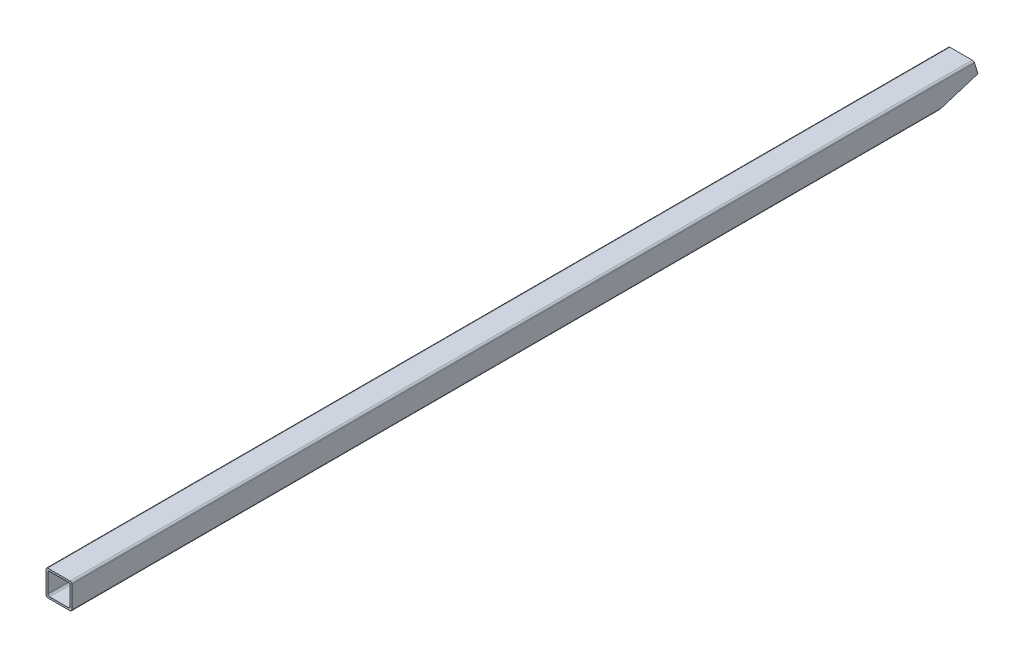
ISO-10303-21;
HEADER;
FILE_DESCRIPTION(('STEP AP214'),'2;1');
FILE_NAME('part.step','',(''),(''),'','','');
FILE_SCHEMA(('AUTOMOTIVE_DESIGN { 1 0 10303 214 1 1 1 1 }'));
ENDSEC;
DATA;
#1=APPLICATION_CONTEXT('core data for automotive mechanical design processes');
#2=APPLICATION_PROTOCOL_DEFINITION('international standard','automotive_design',2000,#1);
#3=PRODUCT_CONTEXT('',#1,'mechanical');
#4=PRODUCT('Part','Part','',(#3));
#5=PRODUCT_RELATED_PRODUCT_CATEGORY('part','',(#4));
#6=PRODUCT_DEFINITION_FORMATION('','',#4);
#7=PRODUCT_DEFINITION_CONTEXT('part definition',#1,'design');
#8=PRODUCT_DEFINITION('design','',#6,#7);
#9=PRODUCT_DEFINITION_SHAPE('','',#8);
#10=(LENGTH_UNIT() NAMED_UNIT(*) SI_UNIT(.MILLI.,.METRE.));
#11=(NAMED_UNIT(*) PLANE_ANGLE_UNIT() SI_UNIT($,.RADIAN.));
#12=(NAMED_UNIT(*) SI_UNIT($,.STERADIAN.) SOLID_ANGLE_UNIT());
#13=UNCERTAINTY_MEASURE_WITH_UNIT(LENGTH_MEASURE(1.E-05),#10,'distance_accuracy_value','');
#14=(GEOMETRIC_REPRESENTATION_CONTEXT(3) GLOBAL_UNCERTAINTY_ASSIGNED_CONTEXT((#13)) GLOBAL_UNIT_ASSIGNED_CONTEXT((#10,
#11,#12)) REPRESENTATION_CONTEXT('',''));
#15=CARTESIAN_POINT('',(0.,0.,0.));
#16=DIRECTION('',(0.,0.,1.));
#17=DIRECTION('',(1.,0.,0.));
#18=AXIS2_PLACEMENT_3D('',#15,#16,#17);
#19=CARTESIAN_POINT('',(2.54,-35.56,1340.));
#20=DIRECTION('',(0.,0.,-1.));
#21=DIRECTION('',(-1.,0.,0.));
#22=AXIS2_PLACEMENT_3D('',#19,#20,#21);
#23=CYLINDRICAL_SURFACE('',#22,2.54);
#24=CARTESIAN_POINT('',(2.54,-35.56,52.8450381213679));
#25=DIRECTION('',(0.,-0.954500927456525,-0.298207946716101));
#26=DIRECTION('',(0.,0.298207946716101,-0.954500927456525));
#27=AXIS2_PLACEMENT_3D('',#24,#25,#26);
#28=ELLIPSE('',#27,8.51754632286215,2.54);
#29=CARTESIAN_POINT('',(2.54000000000002,-38.1,60.9750439861938));
#30=VERTEX_POINT('',#29);
#31=CARTESIAN_POINT('',(0.,-35.56,52.8450381213679));
#32=VERTEX_POINT('',#31);
#33=EDGE_CURVE('E182',#30,#32,#28,.T.);
#34=ORIENTED_EDGE('',*,*,#33,.F.);
#35=DIRECTION('',(0.,0.,-1.));
#36=VECTOR('',#35,1.);
#37=CARTESIAN_POINT('',(2.54000000000002,-38.1,1340.));
#38=LINE('',#37,#36);
#39=CARTESIAN_POINT('',(2.54000000000002,-38.1,1340.));
#40=VERTEX_POINT('',#39);
#41=EDGE_CURVE('E60',#40,#30,#38,.T.);
#42=ORIENTED_EDGE('',*,*,#41,.F.);
#43=CARTESIAN_POINT('',(2.54,-35.56,1340.));
#44=DIRECTION('',(0.,0.,1.));
#45=DIRECTION('',(1.,0.,0.));
#46=AXIS2_PLACEMENT_3D('',#43,#44,#45);
#47=CIRCLE('',#46,2.54);
#48=CARTESIAN_POINT('',(0.,-35.56,1340.));
#49=VERTEX_POINT('',#48);
#50=EDGE_CURVE('E261',#49,#40,#47,.T.);
#51=ORIENTED_EDGE('',*,*,#50,.F.);
#52=DIRECTION('',(0.,0.,-1.));
#53=VECTOR('',#52,1.);
#54=CARTESIAN_POINT('',(0.,-35.56,1340.));
#55=LINE('',#54,#53);
#56=EDGE_CURVE('E278',#49,#32,#55,.T.);
#57=ORIENTED_EDGE('',*,*,#56,.T.);
#58=EDGE_LOOP('',(#34,#42,#51,#57));
#59=FACE_BOUND('',#58,.T.);
#60=ADVANCED_FACE('F53',(#59),#23,.T.);
#61=CARTESIAN_POINT('',(2.54000000000002,-38.1,1340.));
#62=DIRECTION('',(0.,1.,0.));
#63=DIRECTION('',(0.,0.,1.));
#64=AXIS2_PLACEMENT_3D('',#61,#62,#63);
#65=PLANE('',#64);
#66=DIRECTION('',(-1.,0.,0.));
#67=VECTOR('',#66,1.);
#68=CARTESIAN_POINT('',(38.1,-38.1,60.9750439861938));
#69=LINE('',#68,#67);
#70=CARTESIAN_POINT('',(35.56,-38.1,60.9750439861938));
#71=VERTEX_POINT('',#70);
#72=EDGE_CURVE('E187',#71,#30,#69,.T.);
#73=ORIENTED_EDGE('',*,*,#72,.F.);
#74=DIRECTION('',(0.,0.,-1.));
#75=VECTOR('',#74,1.);
#76=CARTESIAN_POINT('',(35.56,-38.1,1340.));
#77=LINE('',#76,#75);
#78=CARTESIAN_POINT('',(35.56,-38.1,1340.));
#79=VERTEX_POINT('',#78);
#80=EDGE_CURVE('E293',#79,#71,#77,.T.);
#81=ORIENTED_EDGE('',*,*,#80,.F.);
#82=DIRECTION('',(1.,0.,0.));
#83=VECTOR('',#82,1.);
#84=CARTESIAN_POINT('',(2.54000000000002,-38.1,1340.));
#85=LINE('',#84,#83);
#86=EDGE_CURVE('E264',#40,#79,#85,.T.);
#87=ORIENTED_EDGE('',*,*,#86,.F.);
#88=ORIENTED_EDGE('',*,*,#41,.T.);
#89=EDGE_LOOP('',(#73,#81,#87,#88));
#90=FACE_BOUND('',#89,.T.);
#91=ADVANCED_FACE('F299',(#90),#65,.F.);
#92=CARTESIAN_POINT('',(35.56,-35.56,1340.));
#93=DIRECTION('',(0.,0.,-1.));
#94=DIRECTION('',(-1.,0.,0.));
#95=AXIS2_PLACEMENT_3D('',#92,#93,#94);
#96=CYLINDRICAL_SURFACE('',#95,2.54);
#97=CARTESIAN_POINT('',(35.56,-35.56,52.8450381213679));
#98=DIRECTION('',(0.,-0.954500927456525,-0.298207946716101));
#99=DIRECTION('',(0.,0.298207946716101,-0.954500927456525));
#100=AXIS2_PLACEMENT_3D('',#97,#98,#99);
#101=ELLIPSE('',#100,8.51754632286215,2.54);
#102=CARTESIAN_POINT('',(38.1,-35.56,52.8450381213679));
#103=VERTEX_POINT('',#102);
#104=EDGE_CURVE('E204',#103,#71,#101,.T.);
#105=ORIENTED_EDGE('',*,*,#104,.F.);
#106=DIRECTION('',(0.,0.,-1.));
#107=VECTOR('',#106,1.);
#108=CARTESIAN_POINT('',(38.1,-35.56,1340.));
#109=LINE('',#108,#107);
#110=CARTESIAN_POINT('',(38.1,-35.56,1340.));
#111=VERTEX_POINT('',#110);
#112=EDGE_CURVE('E290',#111,#103,#109,.T.);
#113=ORIENTED_EDGE('',*,*,#112,.F.);
#114=CARTESIAN_POINT('',(35.56,-35.56,1340.));
#115=DIRECTION('',(0.,0.,1.));
#116=DIRECTION('',(-1.,0.,0.));
#117=AXIS2_PLACEMENT_3D('',#114,#115,#116);
#118=CIRCLE('',#117,2.54);
#119=EDGE_CURVE('E266',#79,#111,#118,.T.);
#120=ORIENTED_EDGE('',*,*,#119,.F.);
#121=ORIENTED_EDGE('',*,*,#80,.T.);
#122=EDGE_LOOP('',(#105,#113,#120,#121));
#123=FACE_BOUND('',#122,.T.);
#124=ADVANCED_FACE('F343',(#123),#96,.T.);
#125=CARTESIAN_POINT('',(38.1,-2.54000000000002,1340.));
#126=DIRECTION('',(-1.,0.,0.));
#127=DIRECTION('',(0.,-1.,0.));
#128=AXIS2_PLACEMENT_3D('',#125,#126,#127);
#129=PLANE('',#128);
#130=DIRECTION('',(0.,-0.298207946716101,0.954500927456525));
#131=VECTOR('',#130,1.);
#132=CARTESIAN_POINT('',(38.1,-17.3559219908177,-5.42238746067884));
#133=LINE('',#132,#131);
#134=CARTESIAN_POINT('',(38.1,-19.05,0.));
#135=VERTEX_POINT('',#134);
#136=EDGE_CURVE('E322',#135,#103,#133,.T.);
#137=ORIENTED_EDGE('',*,*,#136,.F.);
#138=DIRECTION('',(0.,0.954500927456528,0.298207946716092));
#139=VECTOR('',#138,1.);
#140=CARTESIAN_POINT('',(38.1,-1.69407800918215,5.42238746067869));
#141=LINE('',#140,#139);
#142=CARTESIAN_POINT('',(38.1,-2.53999999999999,5.1581020601019));
#143=VERTEX_POINT('',#142);
#144=EDGE_CURVE('E194',#135,#143,#141,.T.);
#145=ORIENTED_EDGE('',*,*,#144,.T.);
#146=DIRECTION('',(0.,0.,-1.));
#147=VECTOR('',#146,1.);
#148=CARTESIAN_POINT('',(38.1,-2.54000000000002,1340.));
#149=LINE('',#148,#147);
#150=CARTESIAN_POINT('',(38.1,-2.54000000000002,1340.));
#151=VERTEX_POINT('',#150);
#152=EDGE_CURVE('E287',#151,#143,#149,.T.);
#153=ORIENTED_EDGE('',*,*,#152,.F.);
#154=DIRECTION('',(0.,1.,0.));
#155=VECTOR('',#154,1.);
#156=CARTESIAN_POINT('',(38.1,-2.54000000000002,1340.));
#157=LINE('',#156,#155);
#158=EDGE_CURVE('E268',#111,#151,#157,.T.);
#159=ORIENTED_EDGE('',*,*,#158,.F.);
#160=ORIENTED_EDGE('',*,*,#112,.T.);
#161=EDGE_LOOP('',(#137,#145,#153,#159,#160));
#162=FACE_BOUND('',#161,.T.);
#163=ADVANCED_FACE('F320',(#162),#129,.F.);
#164=CARTESIAN_POINT('',(0.,-2.54000000000002,1340.));
#165=DIRECTION('',(1.,0.,0.));
#166=DIRECTION('',(0.,1.,0.));
#167=AXIS2_PLACEMENT_3D('',#164,#165,#166);
#168=PLANE('',#167);
#169=DIRECTION('',(0.,-0.298207946716101,0.954500927456525));
#170=VECTOR('',#169,1.);
#171=CARTESIAN_POINT('',(0.,-17.3559219908177,-5.42238746067884));
#172=LINE('',#171,#170);
#173=CARTESIAN_POINT('',(0.,-19.05,0.));
#174=VERTEX_POINT('',#173);
#175=EDGE_CURVE('E176',#174,#32,#172,.T.);
#176=ORIENTED_EDGE('',*,*,#175,.T.);
#177=ORIENTED_EDGE('',*,*,#56,.F.);
#178=DIRECTION('',(0.,-1.,0.));
#179=VECTOR('',#178,1.);
#180=CARTESIAN_POINT('',(0.,-2.54000000000002,1340.));
#181=LINE('',#180,#179);
#182=CARTESIAN_POINT('',(0.,-2.54000000000002,1340.));
#183=VERTEX_POINT('',#182);
#184=EDGE_CURVE('E276',#183,#49,#181,.T.);
#185=ORIENTED_EDGE('',*,*,#184,.F.);
#186=DIRECTION('',(0.,0.,-1.));
#187=VECTOR('',#186,1.);
#188=CARTESIAN_POINT('',(0.,-2.54000000000002,1340.));
#189=LINE('',#188,#187);
#190=CARTESIAN_POINT('',(0.,-2.54000000000002,5.15810206010187));
#191=VERTEX_POINT('',#190);
#192=EDGE_CURVE('E200',#183,#191,#189,.T.);
#193=ORIENTED_EDGE('',*,*,#192,.T.);
#194=DIRECTION('',(0.,0.954500927456528,0.298207946716092));
#195=VECTOR('',#194,1.);
#196=CARTESIAN_POINT('',(0.,-1.69407800918215,5.42238746067869));
#197=LINE('',#196,#195);
#198=EDGE_CURVE('E191',#174,#191,#197,.T.);
#199=ORIENTED_EDGE('',*,*,#198,.F.);
#200=EDGE_LOOP('',(#176,#177,#185,#193,#199));
#201=FACE_BOUND('',#200,.T.);
#202=ADVANCED_FACE('F197',(#201),#168,.F.);
#203=CARTESIAN_POINT('',(5.3086,-32.7914,1340.));
#204=DIRECTION('',(0.,0.,-1.));
#205=DIRECTION('',(-1.,0.,0.));
#206=AXIS2_PLACEMENT_3D('',#203,#204,#205);
#207=CYLINDRICAL_SURFACE('',#206,2.54);
#208=DIRECTION('',(0.,0.,-1.));
#209=VECTOR('',#208,1.);
#210=CARTESIAN_POINT('',(5.30860000000002,-35.3314,1340.));
#211=LINE('',#210,#209);
#212=CARTESIAN_POINT('',(5.30860000000002,-35.3314,1340.));
#213=VERTEX_POINT('',#212);
#214=CARTESIAN_POINT('',(5.30860000000002,-35.3314,52.1133375935337));
#215=VERTEX_POINT('',#214);
#216=EDGE_CURVE('E258',#213,#215,#211,.T.);
#217=ORIENTED_EDGE('',*,*,#216,.T.);
#218=CARTESIAN_POINT('',(5.3086,-32.7914,43.9833317287077));
#219=DIRECTION('',(0.,-0.954500927456525,-0.298207946716101));
#220=DIRECTION('',(0.,0.298207946716101,-0.954500927456525));
#221=AXIS2_PLACEMENT_3D('',#218,#219,#220);
#222=ELLIPSE('',#221,8.51754632286215,2.54);
#223=CARTESIAN_POINT('',(2.7686,-32.7914,43.9833317287079));
#224=VERTEX_POINT('',#223);
#225=EDGE_CURVE('E327',#215,#224,#222,.T.);
#226=ORIENTED_EDGE('',*,*,#225,.T.);
#227=DIRECTION('',(0.,0.,-1.));
#228=VECTOR('',#227,1.);
#229=CARTESIAN_POINT('',(2.7686,-32.7914,1340.));
#230=LINE('',#229,#228);
#231=CARTESIAN_POINT('',(2.7686,-32.7914,1340.));
#232=VERTEX_POINT('',#231);
#233=EDGE_CURVE('E239',#232,#224,#230,.T.);
#234=ORIENTED_EDGE('',*,*,#233,.F.);
#235=CARTESIAN_POINT('',(5.3086,-32.7914,1340.));
#236=DIRECTION('',(0.,0.,1.));
#237=DIRECTION('',(1.,0.,0.));
#238=AXIS2_PLACEMENT_3D('',#235,#236,#237);
#239=CIRCLE('',#238,2.54);
#240=EDGE_CURVE('E223',#232,#213,#239,.T.);
#241=ORIENTED_EDGE('',*,*,#240,.T.);
#242=EDGE_LOOP('',(#217,#226,#234,#241));
#243=FACE_BOUND('',#242,.T.);
#244=ADVANCED_FACE('F379',(#243),#207,.F.);
#245=CARTESIAN_POINT('',(5.30860000000002,-35.3314,1340.));
#246=DIRECTION('',(0.,1.,0.));
#247=DIRECTION('',(0.,0.,1.));
#248=AXIS2_PLACEMENT_3D('',#245,#246,#247);
#249=PLANE('',#248);
#250=DIRECTION('',(0.,0.,-1.));
#251=VECTOR('',#250,1.);
#252=CARTESIAN_POINT('',(32.7914,-35.3314,1340.));
#253=LINE('',#252,#251);
#254=CARTESIAN_POINT('',(32.7914,-35.3314,1340.));
#255=VERTEX_POINT('',#254);
#256=CARTESIAN_POINT('',(32.7914,-35.3314,52.1133375935337));
#257=VERTEX_POINT('',#256);
#258=EDGE_CURVE('E255',#255,#257,#253,.T.);
#259=ORIENTED_EDGE('',*,*,#258,.T.);
#260=DIRECTION('',(-1.,0.,0.));
#261=VECTOR('',#260,1.);
#262=CARTESIAN_POINT('',(5.30860000000052,-35.3314,52.1133375935337));
#263=LINE('',#262,#261);
#264=EDGE_CURVE('E333',#257,#215,#263,.T.);
#265=ORIENTED_EDGE('',*,*,#264,.T.);
#266=ORIENTED_EDGE('',*,*,#216,.F.);
#267=DIRECTION('',(1.,0.,0.));
#268=VECTOR('',#267,1.);
#269=CARTESIAN_POINT('',(5.30860000000002,-35.3314,1340.));
#270=LINE('',#269,#268);
#271=EDGE_CURVE('E225',#213,#255,#270,.T.);
#272=ORIENTED_EDGE('',*,*,#271,.T.);
#273=EDGE_LOOP('',(#259,#265,#266,#272));
#274=FACE_BOUND('',#273,.T.);
#275=ADVANCED_FACE('F388',(#274),#249,.T.);
#276=CARTESIAN_POINT('',(32.7914,-32.7914,1340.));
#277=DIRECTION('',(0.,0.,-1.));
#278=DIRECTION('',(-1.,0.,0.));
#279=AXIS2_PLACEMENT_3D('',#276,#277,#278);
#280=CYLINDRICAL_SURFACE('',#279,2.54);
#281=DIRECTION('',(0.,0.,-1.));
#282=VECTOR('',#281,1.);
#283=CARTESIAN_POINT('',(35.3314,-32.7914,1340.));
#284=LINE('',#283,#282);
#285=CARTESIAN_POINT('',(35.3314,-32.7914,1340.));
#286=VERTEX_POINT('',#285);
#287=CARTESIAN_POINT('',(35.3314,-32.7914,43.9833317287077));
#288=VERTEX_POINT('',#287);
#289=EDGE_CURVE('E252',#286,#288,#284,.T.);
#290=ORIENTED_EDGE('',*,*,#289,.T.);
#291=CARTESIAN_POINT('',(32.7914,-32.7914,43.9833317287077));
#292=DIRECTION('',(0.,-0.954500927456525,-0.298207946716101));
#293=DIRECTION('',(0.,0.298207946716101,-0.954500927456525));
#294=AXIS2_PLACEMENT_3D('',#291,#292,#293);
#295=ELLIPSE('',#294,8.51754632286215,2.54);
#296=EDGE_CURVE('E336',#288,#257,#295,.T.);
#297=ORIENTED_EDGE('',*,*,#296,.T.);
#298=ORIENTED_EDGE('',*,*,#258,.F.);
#299=CARTESIAN_POINT('',(32.7914,-32.7914,1340.));
#300=DIRECTION('',(0.,0.,1.));
#301=DIRECTION('',(1.,0.,0.));
#302=AXIS2_PLACEMENT_3D('',#299,#300,#301);
#303=CIRCLE('',#302,2.54);
#304=EDGE_CURVE('E227',#255,#286,#303,.T.);
#305=ORIENTED_EDGE('',*,*,#304,.T.);
#306=EDGE_LOOP('',(#290,#297,#298,#305));
#307=FACE_BOUND('',#306,.T.);
#308=ADVANCED_FACE('F398',(#307),#280,.F.);
#309=CARTESIAN_POINT('',(35.3314,-5.30860000000002,1340.));
#310=DIRECTION('',(-1.,0.,0.));
#311=DIRECTION('',(0.,0.,1.));
#312=AXIS2_PLACEMENT_3D('',#309,#310,#311);
#313=PLANE('',#312);
#314=DIRECTION('',(0.,0.954500927456528,0.298207946716092));
#315=VECTOR('',#314,1.);
#316=CARTESIAN_POINT('',(35.3314,374.886685761368,123.074841331037));
#317=LINE('',#316,#315);
#318=CARTESIAN_POINT('',(35.3314,-19.05,0.));
#319=VERTEX_POINT('',#318);
#320=CARTESIAN_POINT('',(35.3314,-5.30860000000002,4.29312802233084));
#321=VERTEX_POINT('',#320);
#322=EDGE_CURVE('E216',#319,#321,#317,.T.);
#323=ORIENTED_EDGE('',*,*,#322,.F.);
#324=DIRECTION('',(0.,-0.298207946716101,0.954500927456525));
#325=VECTOR('',#324,1.);
#326=CARTESIAN_POINT('',(35.3314,-399.245285761379,1216.92515866896));
#327=LINE('',#326,#325);
#328=EDGE_CURVE('E339',#319,#288,#327,.T.);
#329=ORIENTED_EDGE('',*,*,#328,.T.);
#330=ORIENTED_EDGE('',*,*,#289,.F.);
#331=DIRECTION('',(0.,1.,0.));
#332=VECTOR('',#331,1.);
#333=CARTESIAN_POINT('',(35.3314,-5.30860000000002,1340.));
#334=LINE('',#333,#332);
#335=CARTESIAN_POINT('',(35.3314,-5.30860000000002,1340.));
#336=VERTEX_POINT('',#335);
#337=EDGE_CURVE('E229',#286,#336,#334,.T.);
#338=ORIENTED_EDGE('',*,*,#337,.T.);
#339=DIRECTION('',(0.,0.,-1.));
#340=VECTOR('',#339,1.);
#341=CARTESIAN_POINT('',(35.3314,-5.30860000000002,1340.));
#342=LINE('',#341,#340);
#343=EDGE_CURVE('E249',#336,#321,#342,.T.);
#344=ORIENTED_EDGE('',*,*,#343,.T.);
#345=EDGE_LOOP('',(#323,#329,#330,#338,#344));
#346=FACE_BOUND('',#345,.T.);
#347=ADVANCED_FACE('F408',(#346),#313,.T.);
#348=CARTESIAN_POINT('',(2.7686,-5.30860000000002,1340.));
#349=DIRECTION('',(1.,0.,0.));
#350=DIRECTION('',(0.,0.,-1.));
#351=AXIS2_PLACEMENT_3D('',#348,#349,#350);
#352=PLANE('',#351);
#353=ORIENTED_EDGE('',*,*,#233,.T.);
#354=DIRECTION('',(0.,0.298207946716101,-0.954500927456525));
#355=VECTOR('',#354,1.);
#356=CARTESIAN_POINT('',(2.7686,-399.245285761379,1216.92515866896));
#357=LINE('',#356,#355);
#358=CARTESIAN_POINT('',(2.7686,-19.05,0.));
#359=VERTEX_POINT('',#358);
#360=EDGE_CURVE('E325',#224,#359,#357,.T.);
#361=ORIENTED_EDGE('',*,*,#360,.T.);
#362=DIRECTION('',(0.,-0.954500927456528,-0.298207946716092));
#363=VECTOR('',#362,1.);
#364=CARTESIAN_POINT('',(2.7686,374.886685761368,123.074841331037));
#365=LINE('',#364,#363);
#366=CARTESIAN_POINT('',(2.7686,-5.30860000000003,4.29312802233103));
#367=VERTEX_POINT('',#366);
#368=EDGE_CURVE('E12',#367,#359,#365,.T.);
#369=ORIENTED_EDGE('',*,*,#368,.F.);
#370=DIRECTION('',(0.,0.,-1.));
#371=VECTOR('',#370,1.);
#372=CARTESIAN_POINT('',(2.7686,-5.30860000000002,1340.));
#373=LINE('',#372,#371);
#374=CARTESIAN_POINT('',(2.7686,-5.30860000000002,1340.));
#375=VERTEX_POINT('',#374);
#376=EDGE_CURVE('E73',#375,#367,#373,.T.);
#377=ORIENTED_EDGE('',*,*,#376,.F.);
#378=DIRECTION('',(0.,-1.,0.));
#379=VECTOR('',#378,1.);
#380=CARTESIAN_POINT('',(2.7686,-5.30860000000002,1340.));
#381=LINE('',#380,#379);
#382=EDGE_CURVE('E237',#375,#232,#381,.T.);
#383=ORIENTED_EDGE('',*,*,#382,.T.);
#384=EDGE_LOOP('',(#353,#361,#369,#377,#383));
#385=FACE_BOUND('',#384,.T.);
#386=ADVANCED_FACE('F418',(#385),#352,.T.);
#387=CARTESIAN_POINT('',(2.54,-35.56,1340.));
#388=DIRECTION('',(0.,0.,1.));
#389=DIRECTION('',(1.,0.,0.));
#390=AXIS2_PLACEMENT_3D('',#387,#388,#389);
#391=PLANE('',#390);
#392=ORIENTED_EDGE('',*,*,#50,.T.);
#393=ORIENTED_EDGE('',*,*,#86,.T.);
#394=ORIENTED_EDGE('',*,*,#119,.T.);
#395=ORIENTED_EDGE('',*,*,#158,.T.);
#396=CARTESIAN_POINT('',(35.56,-2.54,1340.));
#397=DIRECTION('',(0.,0.,1.));
#398=DIRECTION('',(1.,0.,0.));
#399=AXIS2_PLACEMENT_3D('',#396,#397,#398);
#400=CIRCLE('',#399,2.54);
#401=CARTESIAN_POINT('',(35.56,0.,1340.));
#402=VERTEX_POINT('',#401);
#403=EDGE_CURVE('E270',#151,#402,#400,.T.);
#404=ORIENTED_EDGE('',*,*,#403,.T.);
#405=DIRECTION('',(-1.,0.,0.));
#406=VECTOR('',#405,1.);
#407=CARTESIAN_POINT('',(2.54000000000002,0.,1340.));
#408=LINE('',#407,#406);
#409=CARTESIAN_POINT('',(2.54000000000002,0.,1340.));
#410=VERTEX_POINT('',#409);
#411=EDGE_CURVE('E272',#402,#410,#408,.T.);
#412=ORIENTED_EDGE('',*,*,#411,.T.);
#413=CARTESIAN_POINT('',(2.54,-2.54,1340.));
#414=DIRECTION('',(0.,0.,1.));
#415=DIRECTION('',(-1.,0.,0.));
#416=AXIS2_PLACEMENT_3D('',#413,#414,#415);
#417=CIRCLE('',#416,2.54);
#418=EDGE_CURVE('E274',#410,#183,#417,.T.);
#419=ORIENTED_EDGE('',*,*,#418,.T.);
#420=ORIENTED_EDGE('',*,*,#184,.T.);
#421=EDGE_LOOP('',(#392,#393,#394,#395,#404,#412,#419,#420));
#422=FACE_BOUND('',#421,.T.);
#423=ORIENTED_EDGE('',*,*,#271,.F.);
#424=ORIENTED_EDGE('',*,*,#240,.F.);
#425=ORIENTED_EDGE('',*,*,#382,.F.);
#426=CARTESIAN_POINT('',(5.3086,-5.3086,1340.));
#427=DIRECTION('',(0.,0.,1.));
#428=DIRECTION('',(1.,0.,0.));
#429=AXIS2_PLACEMENT_3D('',#426,#427,#428);
#430=CIRCLE('',#429,2.54);
#431=CARTESIAN_POINT('',(5.30860000000002,-2.7686,1340.));
#432=VERTEX_POINT('',#431);
#433=EDGE_CURVE('E235',#432,#375,#430,.T.);
#434=ORIENTED_EDGE('',*,*,#433,.F.);
#435=DIRECTION('',(-1.,0.,0.));
#436=VECTOR('',#435,1.);
#437=CARTESIAN_POINT('',(5.30860000000002,-2.7686,1340.));
#438=LINE('',#437,#436);
#439=CARTESIAN_POINT('',(32.7914,-2.7686,1340.));
#440=VERTEX_POINT('',#439);
#441=EDGE_CURVE('E233',#440,#432,#438,.T.);
#442=ORIENTED_EDGE('',*,*,#441,.F.);
#443=CARTESIAN_POINT('',(32.7914,-5.3086,1340.));
#444=DIRECTION('',(0.,0.,1.));
#445=DIRECTION('',(1.,0.,0.));
#446=AXIS2_PLACEMENT_3D('',#443,#444,#445);
#447=CIRCLE('',#446,2.54);
#448=EDGE_CURVE('E231',#336,#440,#447,.T.);
#449=ORIENTED_EDGE('',*,*,#448,.F.);
#450=ORIENTED_EDGE('',*,*,#337,.F.);
#451=ORIENTED_EDGE('',*,*,#304,.F.);
#452=EDGE_LOOP('',(#423,#424,#425,#434,#442,#449,#450,#451));
#453=FACE_BOUND('',#452,.T.);
#454=ADVANCED_FACE('F304',(#422,#453),#391,.T.);
#455=CARTESIAN_POINT('',(35.56,-2.54,1340.));
#456=DIRECTION('',(0.,0.,-1.));
#457=DIRECTION('',(-1.,0.,0.));
#458=AXIS2_PLACEMENT_3D('',#455,#456,#457);
#459=CYLINDRICAL_SURFACE('',#458,2.54);
#460=ORIENTED_EDGE('',*,*,#152,.T.);
#461=CARTESIAN_POINT('',(35.56,-2.54,5.15810206010192));
#462=DIRECTION('',(0.,-0.298207946716092,0.954500927456528));
#463=DIRECTION('',(0.,-0.954500927456528,-0.298207946716092));
#464=AXIS2_PLACEMENT_3D('',#461,#462,#463);
#465=ELLIPSE('',#464,2.66107651332343,2.54);
#466=CARTESIAN_POINT('',(35.56,0.,5.95165622319448));
#467=VERTEX_POINT('',#466);
#468=EDGE_CURVE('E220',#143,#467,#465,.T.);
#469=ORIENTED_EDGE('',*,*,#468,.T.);
#470=DIRECTION('',(0.,0.,-1.));
#471=VECTOR('',#470,1.);
#472=CARTESIAN_POINT('',(35.56,0.,1340.));
#473=LINE('',#472,#471);
#474=EDGE_CURVE('E284',#402,#467,#473,.T.);
#475=ORIENTED_EDGE('',*,*,#474,.F.);
#476=ORIENTED_EDGE('',*,*,#403,.F.);
#477=EDGE_LOOP('',(#460,#469,#475,#476));
#478=FACE_BOUND('',#477,.T.);
#479=ADVANCED_FACE('F316',(#478),#459,.T.);
#480=CARTESIAN_POINT('',(2.54000000000002,0.,1340.));
#481=DIRECTION('',(0.,-1.,0.));
#482=DIRECTION('',(0.,0.,-1.));
#483=AXIS2_PLACEMENT_3D('',#480,#481,#482);
#484=PLANE('',#483);
#485=ORIENTED_EDGE('',*,*,#474,.T.);
#486=DIRECTION('',(-1.,0.,0.));
#487=VECTOR('',#486,1.);
#488=CARTESIAN_POINT('',(38.1,0.,5.95165622319448));
#489=LINE('',#488,#487);
#490=CARTESIAN_POINT('',(2.54,0.,5.95165622319452));
#491=VERTEX_POINT('',#490);
#492=EDGE_CURVE('E207',#467,#491,#489,.T.);
#493=ORIENTED_EDGE('',*,*,#492,.T.);
#494=DIRECTION('',(0.,0.,-1.));
#495=VECTOR('',#494,1.);
#496=CARTESIAN_POINT('',(2.54000000000002,0.,1340.));
#497=LINE('',#496,#495);
#498=EDGE_CURVE('E281',#410,#491,#497,.T.);
#499=ORIENTED_EDGE('',*,*,#498,.F.);
#500=ORIENTED_EDGE('',*,*,#411,.F.);
#501=EDGE_LOOP('',(#485,#493,#499,#500));
#502=FACE_BOUND('',#501,.T.);
#503=ADVANCED_FACE('F312',(#502),#484,.F.);
#504=CARTESIAN_POINT('',(2.54,-2.54,1340.));
#505=DIRECTION('',(0.,0.,-1.));
#506=DIRECTION('',(-1.,0.,0.));
#507=AXIS2_PLACEMENT_3D('',#504,#505,#506);
#508=CYLINDRICAL_SURFACE('',#507,2.54);
#509=ORIENTED_EDGE('',*,*,#498,.T.);
#510=CARTESIAN_POINT('',(2.54,-2.54,5.15810206010192));
#511=DIRECTION('',(0.,-0.298207946716092,0.954500927456528));
#512=DIRECTION('',(0.,-0.954500927456528,-0.298207946716092));
#513=AXIS2_PLACEMENT_3D('',#510,#511,#512);
#514=ELLIPSE('',#513,2.66107651332343,2.54);
#515=EDGE_CURVE('E218',#491,#191,#514,.T.);
#516=ORIENTED_EDGE('',*,*,#515,.T.);
#517=ORIENTED_EDGE('',*,*,#192,.F.);
#518=ORIENTED_EDGE('',*,*,#418,.F.);
#519=EDGE_LOOP('',(#509,#516,#517,#518));
#520=FACE_BOUND('',#519,.T.);
#521=ADVANCED_FACE('F310',(#520),#508,.T.);
#522=CARTESIAN_POINT('',(32.7914,-5.3086,1340.));
#523=DIRECTION('',(0.,0.,-1.));
#524=DIRECTION('',(-1.,0.,0.));
#525=AXIS2_PLACEMENT_3D('',#522,#523,#524);
#526=CYLINDRICAL_SURFACE('',#525,2.54);
#527=CARTESIAN_POINT('',(32.7914,-5.3086,4.29312802233084));
#528=DIRECTION('',(0.,-0.298207946716092,0.954500927456528));
#529=DIRECTION('',(0.,-0.954500927456528,-0.298207946716092));
#530=AXIS2_PLACEMENT_3D('',#527,#528,#529);
#531=ELLIPSE('',#530,2.66107651332343,2.54);
#532=CARTESIAN_POINT('',(32.7914,-2.7686,5.08668218542341));
#533=VERTEX_POINT('',#532);
#534=EDGE_CURVE('E214',#321,#533,#531,.T.);
#535=ORIENTED_EDGE('',*,*,#534,.F.);
#536=ORIENTED_EDGE('',*,*,#343,.F.);
#537=ORIENTED_EDGE('',*,*,#448,.T.);
#538=DIRECTION('',(0.,0.,-1.));
#539=VECTOR('',#538,1.);
#540=CARTESIAN_POINT('',(32.7914,-2.7686,1340.));
#541=LINE('',#540,#539);
#542=EDGE_CURVE('E246',#440,#533,#541,.T.);
#543=ORIENTED_EDGE('',*,*,#542,.T.);
#544=EDGE_LOOP('',(#535,#536,#537,#543));
#545=FACE_BOUND('',#544,.T.);
#546=ADVANCED_FACE('F455',(#545),#526,.F.);
#547=CARTESIAN_POINT('',(5.30860000000002,-2.7686,1340.));
#548=DIRECTION('',(0.,-1.,0.));
#549=DIRECTION('',(0.,0.,-1.));
#550=AXIS2_PLACEMENT_3D('',#547,#548,#549);
#551=PLANE('',#550);
#552=DIRECTION('',(-1.,0.,0.));
#553=VECTOR('',#552,1.);
#554=CARTESIAN_POINT('',(5.30859999999997,-2.7686,5.08668218542341));
#555=LINE('',#554,#553);
#556=CARTESIAN_POINT('',(5.30860000000002,-2.7686,5.08668218542341));
#557=VERTEX_POINT('',#556);
#558=EDGE_CURVE('E212',#533,#557,#555,.T.);
#559=ORIENTED_EDGE('',*,*,#558,.F.);
#560=ORIENTED_EDGE('',*,*,#542,.F.);
#561=ORIENTED_EDGE('',*,*,#441,.T.);
#562=DIRECTION('',(0.,0.,-1.));
#563=VECTOR('',#562,1.);
#564=CARTESIAN_POINT('',(5.30860000000002,-2.7686,1340.));
#565=LINE('',#564,#563);
#566=EDGE_CURVE('E243',#432,#557,#565,.T.);
#567=ORIENTED_EDGE('',*,*,#566,.T.);
#568=EDGE_LOOP('',(#559,#560,#561,#567));
#569=FACE_BOUND('',#568,.T.);
#570=ADVANCED_FACE('F464',(#569),#551,.T.);
#571=CARTESIAN_POINT('',(5.3086,-5.3086,1340.));
#572=DIRECTION('',(0.,0.,-1.));
#573=DIRECTION('',(-1.,0.,0.));
#574=AXIS2_PLACEMENT_3D('',#571,#572,#573);
#575=CYLINDRICAL_SURFACE('',#574,2.54);
#576=CARTESIAN_POINT('',(5.3086,-5.3086,4.29312802233084));
#577=DIRECTION('',(0.,-0.298207946716092,0.954500927456528));
#578=DIRECTION('',(0.,-0.954500927456528,-0.298207946716092));
#579=AXIS2_PLACEMENT_3D('',#576,#577,#578);
#580=ELLIPSE('',#579,2.66107651332343,2.54);
#581=EDGE_CURVE('E66',#557,#367,#580,.T.);
#582=ORIENTED_EDGE('',*,*,#581,.F.);
#583=ORIENTED_EDGE('',*,*,#566,.F.);
#584=ORIENTED_EDGE('',*,*,#433,.T.);
#585=ORIENTED_EDGE('',*,*,#376,.T.);
#586=EDGE_LOOP('',(#582,#583,#584,#585));
#587=FACE_BOUND('',#586,.T.);
#588=ADVANCED_FACE('F474',(#587),#575,.F.);
#589=CARTESIAN_POINT('',(38.1,-1.69407800918215,5.42238746067869));
#590=DIRECTION('',(0.,-0.298207946716092,0.954500927456528));
#591=DIRECTION('',(0.,-0.954500927456528,-0.298207946716092));
#592=AXIS2_PLACEMENT_3D('',#589,#590,#591);
#593=PLANE('',#592);
#594=ORIENTED_EDGE('',*,*,#144,.F.);
#595=DIRECTION('',(-1.,0.,0.));
#596=VECTOR('',#595,1.);
#597=CARTESIAN_POINT('',(38.1,-19.05,0.));
#598=LINE('',#597,#596);
#599=EDGE_CURVE('E193',#135,#319,#598,.T.);
#600=ORIENTED_EDGE('',*,*,#599,.T.);
#601=ORIENTED_EDGE('',*,*,#322,.T.);
#602=ORIENTED_EDGE('',*,*,#534,.T.);
#603=ORIENTED_EDGE('',*,*,#558,.T.);
#604=ORIENTED_EDGE('',*,*,#581,.T.);
#605=ORIENTED_EDGE('',*,*,#368,.T.);
#606=EDGE_CURVE('E179',#359,#174,#598,.T.);
#607=ORIENTED_EDGE('',*,*,#606,.T.);
#608=ORIENTED_EDGE('',*,*,#198,.T.);
#609=ORIENTED_EDGE('',*,*,#515,.F.);
#610=ORIENTED_EDGE('',*,*,#492,.F.);
#611=ORIENTED_EDGE('',*,*,#468,.F.);
#612=EDGE_LOOP('',(#594,#600,#601,#602,#603,#604,#605,#607,#608,#609,#610,#611));
#613=FACE_BOUND('',#612,.T.);
#614=ADVANCED_FACE('F190',(#613),#593,.F.);
#615=CARTESIAN_POINT('',(38.1,-17.3559219908177,-5.42238746067884));
#616=DIRECTION('',(0.,-0.954500927456525,-0.298207946716101));
#617=DIRECTION('',(0.,0.298207946716101,-0.954500927456525));
#618=AXIS2_PLACEMENT_3D('',#615,#616,#617);
#619=PLANE('',#618);
#620=ORIENTED_EDGE('',*,*,#33,.T.);
#621=ORIENTED_EDGE('',*,*,#175,.F.);
#622=ORIENTED_EDGE('',*,*,#606,.F.);
#623=ORIENTED_EDGE('',*,*,#360,.F.);
#624=ORIENTED_EDGE('',*,*,#225,.F.);
#625=ORIENTED_EDGE('',*,*,#264,.F.);
#626=ORIENTED_EDGE('',*,*,#296,.F.);
#627=ORIENTED_EDGE('',*,*,#328,.F.);
#628=ORIENTED_EDGE('',*,*,#599,.F.);
#629=ORIENTED_EDGE('',*,*,#136,.T.);
#630=ORIENTED_EDGE('',*,*,#104,.T.);
#631=ORIENTED_EDGE('',*,*,#72,.T.);
#632=EDGE_LOOP('',(#620,#621,#622,#623,#624,#625,#626,#627,#628,#629,#630,#631));
#633=FACE_BOUND('',#632,.T.);
#634=ADVANCED_FACE('F178',(#633),#619,.T.);
#635=CLOSED_SHELL('',(#60,#91,#124,#163,#202,#244,#275,#308,#347,#386,#454,#479,#503,#521,#546,
#570,#588,#614,#634));
#636=MANIFOLD_SOLID_BREP('B2',#635);
#637=ADVANCED_BREP_SHAPE_REPRESENTATION('',(#18,#636),#14);
#638=SHAPE_DEFINITION_REPRESENTATION(#9,#637);
ENDSEC;
END-ISO-10303-21;
